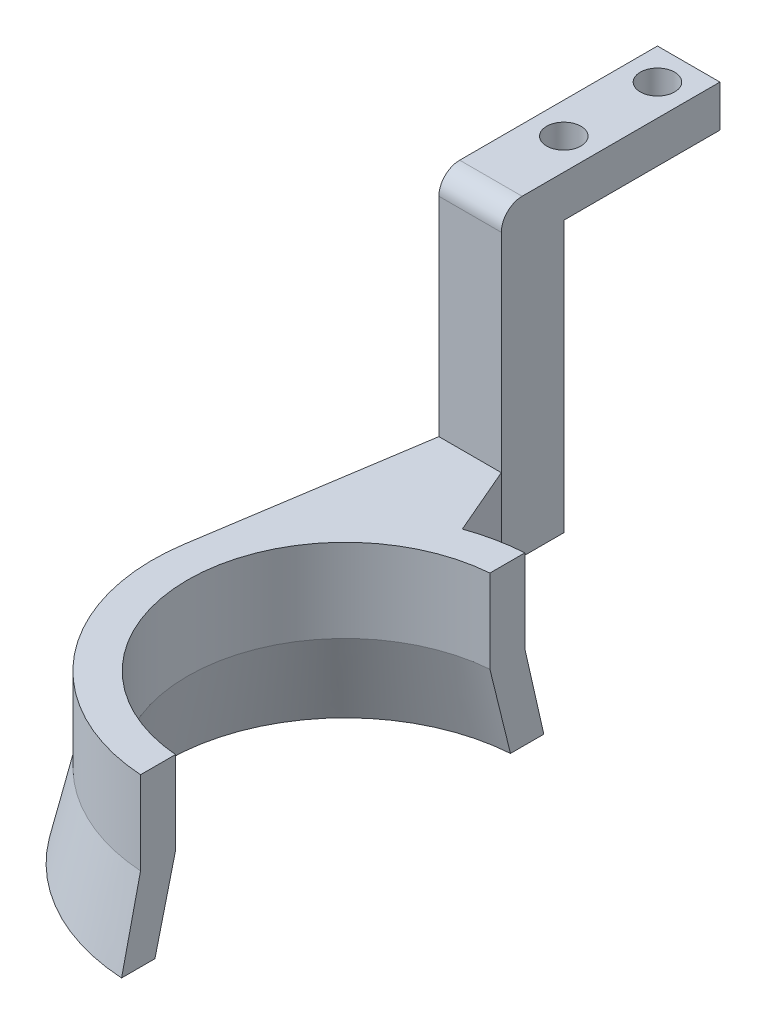
ISO-10303-21;
HEADER;
FILE_DESCRIPTION(('STEP AP214'),'2;1');
FILE_NAME('part.step','',(''),(''),'','','');
FILE_SCHEMA(('AUTOMOTIVE_DESIGN { 1 0 10303 214 1 1 1 1 }'));
ENDSEC;
DATA;
#1=APPLICATION_CONTEXT('core data for automotive mechanical design processes');
#2=APPLICATION_PROTOCOL_DEFINITION('international standard','automotive_design',2000,#1);
#3=PRODUCT_CONTEXT('',#1,'mechanical');
#4=PRODUCT('Part','Part','',(#3));
#5=PRODUCT_RELATED_PRODUCT_CATEGORY('part','',(#4));
#6=PRODUCT_DEFINITION_FORMATION('','',#4);
#7=PRODUCT_DEFINITION_CONTEXT('part definition',#1,'design');
#8=PRODUCT_DEFINITION('design','',#6,#7);
#9=PRODUCT_DEFINITION_SHAPE('','',#8);
#10=(LENGTH_UNIT() NAMED_UNIT(*) SI_UNIT(.MILLI.,.METRE.));
#11=(NAMED_UNIT(*) PLANE_ANGLE_UNIT() SI_UNIT($,.RADIAN.));
#12=(NAMED_UNIT(*) SI_UNIT($,.STERADIAN.) SOLID_ANGLE_UNIT());
#13=UNCERTAINTY_MEASURE_WITH_UNIT(LENGTH_MEASURE(1.E-05),#10,'distance_accuracy_value','');
#14=(GEOMETRIC_REPRESENTATION_CONTEXT(3) GLOBAL_UNCERTAINTY_ASSIGNED_CONTEXT((#13)) GLOBAL_UNIT_ASSIGNED_CONTEXT((#10,
#11,#12)) REPRESENTATION_CONTEXT('',''));
#15=CARTESIAN_POINT('',(0.,0.,0.));
#16=DIRECTION('',(0.,0.,1.));
#17=DIRECTION('',(1.,0.,0.));
#18=AXIS2_PLACEMENT_3D('',#15,#16,#17);
#19=CARTESIAN_POINT('',(0.,-20.,0.));
#20=DIRECTION('',(0.,1.,0.));
#21=DIRECTION('',(0.,0.,1.));
#22=AXIS2_PLACEMENT_3D('',#19,#20,#21);
#23=PLANE('',#22);
#24=DIRECTION('',(1.,0.,0.));
#25=VECTOR('',#24,1.);
#26=CARTESIAN_POINT('',(0.,-20.,21.));
#27=LINE('',#26,#25);
#28=CARTESIAN_POINT('',(0.,-20.,21.));
#29=VERTEX_POINT('',#28);
#30=CARTESIAN_POINT('',(6.,-20.,21.));
#31=VERTEX_POINT('',#30);
#32=EDGE_CURVE('E361',#29,#31,#27,.T.);
#33=ORIENTED_EDGE('',*,*,#32,.F.);
#34=DIRECTION('',(-0.153201646089768,0.,0.988194948193617));
#35=VECTOR('',#34,1.);
#36=CARTESIAN_POINT('',(0.,-20.,21.));
#37=LINE('',#36,#35);
#38=CARTESIAN_POINT('',(-3.26704893613209,-20.,42.0734110017026));
#39=VERTEX_POINT('',#38);
#40=EDGE_CURVE('E223',#29,#39,#37,.T.);
#41=ORIENTED_EDGE('',*,*,#40,.T.);
#42=CARTESIAN_POINT('',(-3.26704893613209,-20.,42.0734110017026));
#43=DIRECTION('',(-0.15320164608977,0.,0.988194948193617));
#44=VECTOR('',#43,1.);
#45=LINE('',#42,#44);
#46=CARTESIAN_POINT('',(-3.29569718353048,-20.,42.2582004871701));
#47=VERTEX_POINT('',#46);
#48=EDGE_CURVE('E61',#39,#47,#45,.T.);
#49=ORIENTED_EDGE('',*,*,#48,.T.);
#50=CARTESIAN_POINT('',(15.,-20.,45.));
#51=DIRECTION('',(0.,1.,0.));
#52=DIRECTION('',(0.,0.,1.));
#53=AXIS2_PLACEMENT_3D('',#50,#51,#52);
#54=CIRCLE('',#53,18.5);
#55=CARTESIAN_POINT('',(13.8,-20.0000000000001,63.4610400573749));
#56=VERTEX_POINT('',#55);
#57=EDGE_CURVE('E242',#47,#56,#54,.T.);
#58=ORIENTED_EDGE('',*,*,#57,.T.);
#59=DIRECTION('',(0.,0.,1.));
#60=VECTOR('',#59,1.);
#61=CARTESIAN_POINT('',(13.8,-20.,0.));
#62=LINE('',#61,#60);
#63=CARTESIAN_POINT('',(13.8,-20.0000000000001,60.1024004714482));
#64=VERTEX_POINT('',#63);
#65=EDGE_CURVE('E245',#64,#56,#62,.T.);
#66=ORIENTED_EDGE('',*,*,#65,.F.);
#67=CARTESIAN_POINT('',(15.,-20.,45.));
#68=DIRECTION('',(0.,1.,0.));
#69=DIRECTION('',(0.,0.,1.));
#70=AXIS2_PLACEMENT_3D('',#67,#68,#69);
#71=CIRCLE('',#70,15.15);
#72=CARTESIAN_POINT('',(13.8,-20.,29.8975995285518));
#73=VERTEX_POINT('',#72);
#74=EDGE_CURVE('E230',#73,#64,#71,.T.);
#75=ORIENTED_EDGE('',*,*,#74,.F.);
#76=CARTESIAN_POINT('',(13.8,-20.,26.5389599426251));
#77=VERTEX_POINT('',#76);
#78=EDGE_CURVE('E239',#77,#73,#62,.T.);
#79=ORIENTED_EDGE('',*,*,#78,.F.);
#80=CARTESIAN_POINT('',(8.81617345650081,-20.,27.5641091629961));
#81=VERTEX_POINT('',#80);
#82=EDGE_CURVE('E234',#77,#81,#54,.T.);
#83=ORIENTED_EDGE('',*,*,#82,.T.);
#84=DIRECTION('',(0.394272189935279,0.,0.918993710665987));
#85=VECTOR('',#84,1.);
#86=CARTESIAN_POINT('',(-2.54171027819971,-20.,1.09045977783739));
#87=LINE('',#86,#85);
#88=EDGE_CURVE('E238',#31,#81,#87,.T.);
#89=ORIENTED_EDGE('',*,*,#88,.F.);
#90=EDGE_LOOP('',(#33,#41,#49,#58,#66,#75,#79,#83,#89));
#91=FACE_BOUND('',#90,.T.);
#92=ADVANCED_FACE('F51',(#91),#23,.T.);
#93=CARTESIAN_POINT('',(0.,-28.,0.));
#94=DIRECTION('',(0.,1.,0.));
#95=DIRECTION('',(0.,0.,1.));
#96=AXIS2_PLACEMENT_3D('',#93,#94,#95);
#97=PLANE('',#96);
#98=DIRECTION('',(0.394272189935279,0.,0.918993710665987));
#99=VECTOR('',#98,1.);
#100=CARTESIAN_POINT('',(-2.54171027819971,-28.,1.09045977783738));
#101=LINE('',#100,#99);
#102=CARTESIAN_POINT('',(6.,-28.,21.));
#103=VERTEX_POINT('',#102);
#104=CARTESIAN_POINT('',(8.81614120127154,-28.,27.5640274167845));
#105=VERTEX_POINT('',#104);
#106=EDGE_CURVE('E257',#103,#105,#101,.T.);
#107=ORIENTED_EDGE('',*,*,#106,.T.);
#108=CARTESIAN_POINT('',(13.8,-28.0000000000001,63.4610400573749));
#109=CARTESIAN_POINT('',(-18.8133971291866,-28.0000000000001,61.3411120125089));
#110=CARTESIAN_POINT('',(-18.8133971291866,-28.,28.6588879874911));
#111=CARTESIAN_POINT('',(13.8,-28.,26.5389599426251));
#112=(BOUNDED_CURVE() B_SPLINE_CURVE(3,(#108,#109,#110,#111),.UNSPECIFIED.,.F.,
.F.) B_SPLINE_CURVE_WITH_KNOTS((4,4),(0.,1.),
.UNSPECIFIED.) CURVE() GEOMETRIC_REPRESENTATION_ITEM() RATIONAL_B_SPLINE_CURVE((1.,
0.376576576576576,0.376576576576576,1.)) REPRESENTATION_ITEM(''));
#113=CARTESIAN_POINT('',(-3.2670484929375,-28.,42.0734110604464));
#114=VERTEX_POINT('',#113);
#115=EDGE_CURVE('E12',#105,#114,#112,.F.);
#116=ORIENTED_EDGE('',*,*,#115,.T.);
#117=DIRECTION('',(-0.153201646089768,0.,0.988194948193617));
#118=VECTOR('',#117,1.);
#119=CARTESIAN_POINT('',(0.,-28.,21.));
#120=LINE('',#119,#118);
#121=CARTESIAN_POINT('',(0.,-28.,21.));
#122=VERTEX_POINT('',#121);
#123=EDGE_CURVE('E220',#122,#114,#120,.T.);
#124=ORIENTED_EDGE('',*,*,#123,.F.);
#125=DIRECTION('',(0.,0.,-1.));
#126=VECTOR('',#125,1.);
#127=CARTESIAN_POINT('',(0.,-28.,15.));
#128=LINE('',#127,#126);
#129=CARTESIAN_POINT('',(0.,-28.,15.));
#130=VERTEX_POINT('',#129);
#131=EDGE_CURVE('E336',#122,#130,#128,.T.);
#132=ORIENTED_EDGE('',*,*,#131,.T.);
#133=DIRECTION('',(1.,0.,0.));
#134=VECTOR('',#133,1.);
#135=CARTESIAN_POINT('',(0.,-28.,15.));
#136=LINE('',#135,#134);
#137=CARTESIAN_POINT('',(6.00000000000001,-28.,15.));
#138=VERTEX_POINT('',#137);
#139=EDGE_CURVE('E338',#130,#138,#136,.T.);
#140=ORIENTED_EDGE('',*,*,#139,.T.);
#141=DIRECTION('',(0.,0.,1.));
#142=VECTOR('',#141,1.);
#143=CARTESIAN_POINT('',(6.00000000000001,-28.,15.));
#144=LINE('',#143,#142);
#145=EDGE_CURVE('E341',#138,#103,#144,.T.);
#146=ORIENTED_EDGE('',*,*,#145,.T.);
#147=EDGE_LOOP('',(#107,#116,#124,#132,#140,#146));
#148=FACE_BOUND('',#147,.T.);
#149=ADVANCED_FACE('F386',(#148),#97,.F.);
#150=CARTESIAN_POINT('',(13.8,-28.,0.));
#151=DIRECTION('',(-1.,0.,0.));
#152=DIRECTION('',(0.,0.,1.));
#153=AXIS2_PLACEMENT_3D('',#150,#151,#152);
#154=PLANE('',#153);
#155=DIRECTION('',(0.,1.,0.));
#156=VECTOR('',#155,1.);
#157=CARTESIAN_POINT('',(13.8,-28.0000000000001,63.4610400573749));
#158=LINE('',#157,#156);
#159=CARTESIAN_POINT('',(13.8,-28.0000000000001,63.4610400573749));
#160=VERTEX_POINT('',#159);
#161=EDGE_CURVE('E295',#160,#56,#158,.T.);
#162=ORIENTED_EDGE('',*,*,#161,.F.);
#163=DIRECTION('',(0.,-0.97499269726956,0.222236901236109));
#164=VECTOR('',#163,1.);
#165=CARTESIAN_POINT('',(13.8,-28.0000000000001,63.4610400573749));
#166=LINE('',#165,#164);
#167=CARTESIAN_POINT('',(13.8,-36.0000000000001,65.2845359818754));
#168=VERTEX_POINT('',#167);
#169=EDGE_CURVE('E432',#160,#168,#166,.T.);
#170=ORIENTED_EDGE('',*,*,#169,.T.);
#171=DIRECTION('',(0.,0.,1.));
#172=VECTOR('',#171,1.);
#173=CARTESIAN_POINT('',(13.8,-36.0000000000001,62.0778921415964));
#174=LINE('',#173,#172);
#175=CARTESIAN_POINT('',(13.8,-36.0000000000001,62.0778921415964));
#176=VERTEX_POINT('',#175);
#177=EDGE_CURVE('E303',#176,#168,#174,.T.);
#178=ORIENTED_EDGE('',*,*,#177,.F.);
#179=DIRECTION('',(0.,-0.970838274147742,0.239735365454984));
#180=VECTOR('',#179,1.);
#181=CARTESIAN_POINT('',(13.8,-28.0000000000001,60.1024004714482));
#182=LINE('',#181,#180);
#183=CARTESIAN_POINT('',(13.8,-28.,60.1024004714482));
#184=VERTEX_POINT('',#183);
#185=EDGE_CURVE('E433',#184,#176,#182,.T.);
#186=ORIENTED_EDGE('',*,*,#185,.F.);
#187=DIRECTION('',(0.,1.,0.));
#188=VECTOR('',#187,1.);
#189=CARTESIAN_POINT('',(13.8,-28.0010000000001,60.1024004714482));
#190=LINE('',#189,#188);
#191=EDGE_CURVE('E232',#184,#64,#190,.T.);
#192=ORIENTED_EDGE('',*,*,#191,.T.);
#193=ORIENTED_EDGE('',*,*,#65,.T.);
#194=EDGE_LOOP('',(#162,#170,#178,#186,#192,#193));
#195=FACE_BOUND('',#194,.T.);
#196=ADVANCED_FACE('F380',(#195),#154,.F.);
#197=CARTESIAN_POINT('',(6.,2.,0.));
#198=DIRECTION('',(-1.,0.,0.));
#199=DIRECTION('',(0.,0.,1.));
#200=AXIS2_PLACEMENT_3D('',#197,#198,#199);
#201=PLANE('',#200);
#202=DIRECTION('',(0.,0.,1.));
#203=VECTOR('',#202,1.);
#204=CARTESIAN_POINT('',(6.,-2.,15.));
#205=LINE('',#204,#203);
#206=CARTESIAN_POINT('',(6.,-2.,0.));
#207=VERTEX_POINT('',#206);
#208=CARTESIAN_POINT('',(6.,-2.,15.));
#209=VERTEX_POINT('',#208);
#210=EDGE_CURVE('E426',#207,#209,#205,.T.);
#211=ORIENTED_EDGE('',*,*,#210,.F.);
#212=DIRECTION('',(0.,-1.,0.));
#213=VECTOR('',#212,1.);
#214=CARTESIAN_POINT('',(6.,2.,0.));
#215=LINE('',#214,#213);
#216=CARTESIAN_POINT('',(6.,2.,0.));
#217=VERTEX_POINT('',#216);
#218=EDGE_CURVE('E192',#217,#207,#215,.T.);
#219=ORIENTED_EDGE('',*,*,#218,.F.);
#220=DIRECTION('',(0.,0.,-1.));
#221=VECTOR('',#220,1.);
#222=CARTESIAN_POINT('',(6.,2.,0.));
#223=LINE('',#222,#221);
#224=CARTESIAN_POINT('',(6.00000000000001,2.,19.));
#225=VERTEX_POINT('',#224);
#226=EDGE_CURVE('E177',#225,#217,#223,.T.);
#227=ORIENTED_EDGE('',*,*,#226,.F.);
#228=CARTESIAN_POINT('',(6.00000000000001,0.,19.));
#229=DIRECTION('',(1.,0.,0.));
#230=DIRECTION('',(0.,0.,-1.));
#231=AXIS2_PLACEMENT_3D('',#228,#229,#230);
#232=CIRCLE('',#231,2.);
#233=CARTESIAN_POINT('',(6.00000000000001,0.,21.));
#234=VERTEX_POINT('',#233);
#235=EDGE_CURVE('E356',#225,#234,#232,.T.);
#236=ORIENTED_EDGE('',*,*,#235,.T.);
#237=DIRECTION('',(0.,-1.,0.));
#238=VECTOR('',#237,1.);
#239=CARTESIAN_POINT('',(6.00000000000001,0.,21.));
#240=LINE('',#239,#238);
#241=EDGE_CURVE('E348',#234,#31,#240,.T.);
#242=ORIENTED_EDGE('',*,*,#241,.T.);
#243=DIRECTION('',(0.,1.,0.));
#244=VECTOR('',#243,1.);
#245=CARTESIAN_POINT('',(6.,-28.,21.));
#246=LINE('',#245,#244);
#247=EDGE_CURVE('E334',#103,#31,#246,.T.);
#248=ORIENTED_EDGE('',*,*,#247,.F.);
#249=ORIENTED_EDGE('',*,*,#145,.F.);
#250=DIRECTION('',(0.,1.,0.));
#251=VECTOR('',#250,1.);
#252=CARTESIAN_POINT('',(6.,2.,15.));
#253=LINE('',#252,#251);
#254=EDGE_CURVE('E344',#138,#209,#253,.T.);
#255=ORIENTED_EDGE('',*,*,#254,.T.);
#256=EDGE_LOOP('',(#211,#219,#227,#236,#242,#248,#249,#255));
#257=FACE_BOUND('',#256,.T.);
#258=ADVANCED_FACE('F372',(#257),#201,.F.);
#259=CARTESIAN_POINT('',(0.,2.,0.));
#260=DIRECTION('',(0.,1.,0.));
#261=DIRECTION('',(0.,0.,1.));
#262=AXIS2_PLACEMENT_3D('',#259,#260,#261);
#263=PLANE('',#262);
#264=CARTESIAN_POINT('',(3.,2.,3.));
#265=DIRECTION('',(0.,1.,0.));
#266=DIRECTION('',(0.,0.,1.));
#267=AXIS2_PLACEMENT_3D('',#264,#265,#266);
#268=CIRCLE('',#267,1.65);
#269=CARTESIAN_POINT('',(3.,2.,4.65));
#270=VERTEX_POINT('',#269);
#271=EDGE_CURVE('E199',#270,#270,#268,.T.);
#272=ORIENTED_EDGE('',*,*,#271,.F.);
#273=EDGE_LOOP('',(#272));
#274=FACE_BOUND('',#273,.T.);
#275=DIRECTION('',(0.,0.,1.));
#276=VECTOR('',#275,1.);
#277=CARTESIAN_POINT('',(0.,2.,0.));
#278=LINE('',#277,#276);
#279=CARTESIAN_POINT('',(0.,2.,0.));
#280=VERTEX_POINT('',#279);
#281=CARTESIAN_POINT('',(0.,2.,19.));
#282=VERTEX_POINT('',#281);
#283=EDGE_CURVE('E175',#280,#282,#278,.T.);
#284=ORIENTED_EDGE('',*,*,#283,.T.);
#285=DIRECTION('',(1.,0.,0.));
#286=VECTOR('',#285,1.);
#287=CARTESIAN_POINT('',(0.,2.,19.));
#288=LINE('',#287,#286);
#289=EDGE_CURVE('E353',#282,#225,#288,.T.);
#290=ORIENTED_EDGE('',*,*,#289,.T.);
#291=ORIENTED_EDGE('',*,*,#226,.T.);
#292=DIRECTION('',(-1.,0.,0.));
#293=VECTOR('',#292,1.);
#294=CARTESIAN_POINT('',(0.,2.,0.));
#295=LINE('',#294,#293);
#296=EDGE_CURVE('E169',#217,#280,#295,.T.);
#297=ORIENTED_EDGE('',*,*,#296,.T.);
#298=EDGE_LOOP('',(#284,#290,#291,#297));
#299=FACE_BOUND('',#298,.T.);
#300=CARTESIAN_POINT('',(3.,2.,12.));
#301=DIRECTION('',(0.,1.,0.));
#302=DIRECTION('',(0.,0.,1.));
#303=AXIS2_PLACEMENT_3D('',#300,#301,#302);
#304=CIRCLE('',#303,1.65);
#305=CARTESIAN_POINT('',(3.,2.,13.65));
#306=VERTEX_POINT('',#305);
#307=EDGE_CURVE('E203',#306,#306,#304,.T.);
#308=ORIENTED_EDGE('',*,*,#307,.F.);
#309=EDGE_LOOP('',(#308));
#310=FACE_BOUND('',#309,.T.);
#311=ADVANCED_FACE('F171',(#274,#299,#310),#263,.T.);
#312=CARTESIAN_POINT('',(0.,2.,0.));
#313=DIRECTION('',(1.,0.,0.));
#314=DIRECTION('',(0.,0.,-1.));
#315=AXIS2_PLACEMENT_3D('',#312,#313,#314);
#316=PLANE('',#315);
#317=ORIENTED_EDGE('',*,*,#131,.F.);
#318=DIRECTION('',(0.,1.,0.));
#319=VECTOR('',#318,1.);
#320=CARTESIAN_POINT('',(0.,-28.,21.));
#321=LINE('',#320,#319);
#322=EDGE_CURVE('E218',#122,#29,#321,.T.);
#323=ORIENTED_EDGE('',*,*,#322,.T.);
#324=DIRECTION('',(0.,-1.,0.));
#325=VECTOR('',#324,1.);
#326=CARTESIAN_POINT('',(0.,0.,21.));
#327=LINE('',#326,#325);
#328=CARTESIAN_POINT('',(0.,0.,21.));
#329=VERTEX_POINT('',#328);
#330=EDGE_CURVE('E350',#329,#29,#327,.T.);
#331=ORIENTED_EDGE('',*,*,#330,.F.);
#332=CARTESIAN_POINT('',(0.,0.,19.));
#333=DIRECTION('',(1.,0.,0.));
#334=DIRECTION('',(0.,0.,-1.));
#335=AXIS2_PLACEMENT_3D('',#332,#333,#334);
#336=CIRCLE('',#335,2.);
#337=EDGE_CURVE('E198',#282,#329,#336,.T.);
#338=ORIENTED_EDGE('',*,*,#337,.F.);
#339=ORIENTED_EDGE('',*,*,#283,.F.);
#340=DIRECTION('',(0.,-1.,0.));
#341=VECTOR('',#340,1.);
#342=CARTESIAN_POINT('',(0.,2.,0.));
#343=LINE('',#342,#341);
#344=CARTESIAN_POINT('',(0.,-2.,0.));
#345=VERTEX_POINT('',#344);
#346=EDGE_CURVE('E181',#280,#345,#343,.T.);
#347=ORIENTED_EDGE('',*,*,#346,.T.);
#348=DIRECTION('',(0.,0.,-1.));
#349=VECTOR('',#348,1.);
#350=CARTESIAN_POINT('',(0.,-2.,15.));
#351=LINE('',#350,#349);
#352=CARTESIAN_POINT('',(0.,-2.,15.));
#353=VERTEX_POINT('',#352);
#354=EDGE_CURVE('E421',#353,#345,#351,.T.);
#355=ORIENTED_EDGE('',*,*,#354,.F.);
#356=DIRECTION('',(0.,1.,0.));
#357=VECTOR('',#356,1.);
#358=CARTESIAN_POINT('',(0.,2.,15.));
#359=LINE('',#358,#357);
#360=EDGE_CURVE('E345',#130,#353,#359,.T.);
#361=ORIENTED_EDGE('',*,*,#360,.F.);
#362=EDGE_LOOP('',(#317,#323,#331,#338,#339,#347,#355,#361));
#363=FACE_BOUND('',#362,.T.);
#364=ADVANCED_FACE('F53',(#363),#316,.F.);
#365=CARTESIAN_POINT('',(0.,2.,0.));
#366=DIRECTION('',(0.,0.,1.));
#367=DIRECTION('',(1.,0.,0.));
#368=AXIS2_PLACEMENT_3D('',#365,#366,#367);
#369=PLANE('',#368);
#370=ORIENTED_EDGE('',*,*,#218,.T.);
#371=DIRECTION('',(1.,0.,0.));
#372=VECTOR('',#371,1.);
#373=CARTESIAN_POINT('',(0.,-2.,0.));
#374=LINE('',#373,#372);
#375=EDGE_CURVE('E188',#345,#207,#374,.T.);
#376=ORIENTED_EDGE('',*,*,#375,.F.);
#377=ORIENTED_EDGE('',*,*,#346,.F.);
#378=ORIENTED_EDGE('',*,*,#296,.F.);
#379=EDGE_LOOP('',(#370,#376,#377,#378));
#380=FACE_BOUND('',#379,.T.);
#381=ADVANCED_FACE('F185',(#380),#369,.F.);
#382=CARTESIAN_POINT('',(3.,2.,3.));
#383=DIRECTION('',(0.,-1.,0.));
#384=DIRECTION('',(0.,0.,-1.));
#385=AXIS2_PLACEMENT_3D('',#382,#383,#384);
#386=CYLINDRICAL_SURFACE('',#385,1.65);
#387=ORIENTED_EDGE('',*,*,#271,.T.);
#388=EDGE_LOOP('',(#387));
#389=FACE_BOUND('',#388,.T.);
#390=CARTESIAN_POINT('',(3.,-2.,3.));
#391=DIRECTION('',(0.,-1.,0.));
#392=DIRECTION('',(0.,0.,-1.));
#393=AXIS2_PLACEMENT_3D('',#390,#391,#392);
#394=CIRCLE('',#393,1.65);
#395=CARTESIAN_POINT('',(3.,-2.,1.35));
#396=VERTEX_POINT('',#395);
#397=EDGE_CURVE('E416',#396,#396,#394,.T.);
#398=ORIENTED_EDGE('',*,*,#397,.T.);
#399=EDGE_LOOP('',(#398));
#400=FACE_BOUND('',#399,.T.);
#401=ADVANCED_FACE('F407',(#389,#400),#386,.F.);
#402=CARTESIAN_POINT('',(3.,2.,12.));
#403=DIRECTION('',(0.,-1.,0.));
#404=DIRECTION('',(0.,0.,-1.));
#405=AXIS2_PLACEMENT_3D('',#402,#403,#404);
#406=CYLINDRICAL_SURFACE('',#405,1.65);
#407=ORIENTED_EDGE('',*,*,#307,.T.);
#408=EDGE_LOOP('',(#407));
#409=FACE_BOUND('',#408,.T.);
#410=CARTESIAN_POINT('',(3.,-2.,12.));
#411=DIRECTION('',(0.,-1.,0.));
#412=DIRECTION('',(0.,0.,-1.));
#413=AXIS2_PLACEMENT_3D('',#410,#411,#412);
#414=CIRCLE('',#413,1.65);
#415=CARTESIAN_POINT('',(3.,-2.,10.35));
#416=VERTEX_POINT('',#415);
#417=EDGE_CURVE('E418',#416,#416,#414,.T.);
#418=ORIENTED_EDGE('',*,*,#417,.T.);
#419=EDGE_LOOP('',(#418));
#420=FACE_BOUND('',#419,.T.);
#421=ADVANCED_FACE('F369',(#409,#420),#406,.F.);
#422=CARTESIAN_POINT('',(0.,2.,15.));
#423=DIRECTION('',(0.,0.,-1.));
#424=DIRECTION('',(-1.,0.,0.));
#425=AXIS2_PLACEMENT_3D('',#422,#423,#424);
#426=PLANE('',#425);
#427=DIRECTION('',(-1.,0.,0.));
#428=VECTOR('',#427,1.);
#429=CARTESIAN_POINT('',(0.,-2.,15.));
#430=LINE('',#429,#428);
#431=EDGE_CURVE('E429',#209,#353,#430,.T.);
#432=ORIENTED_EDGE('',*,*,#431,.F.);
#433=ORIENTED_EDGE('',*,*,#254,.F.);
#434=ORIENTED_EDGE('',*,*,#139,.F.);
#435=ORIENTED_EDGE('',*,*,#360,.T.);
#436=EDGE_LOOP('',(#432,#433,#434,#435));
#437=FACE_BOUND('',#436,.T.);
#438=ADVANCED_FACE('F399',(#437),#426,.T.);
#439=CARTESIAN_POINT('',(0.,0.,21.));
#440=DIRECTION('',(0.,0.,1.));
#441=DIRECTION('',(1.,0.,0.));
#442=AXIS2_PLACEMENT_3D('',#439,#440,#441);
#443=PLANE('',#442);
#444=ORIENTED_EDGE('',*,*,#241,.F.);
#445=DIRECTION('',(1.,0.,0.));
#446=VECTOR('',#445,1.);
#447=CARTESIAN_POINT('',(0.,0.,21.));
#448=LINE('',#447,#446);
#449=EDGE_CURVE('E364',#329,#234,#448,.T.);
#450=ORIENTED_EDGE('',*,*,#449,.F.);
#451=ORIENTED_EDGE('',*,*,#330,.T.);
#452=ORIENTED_EDGE('',*,*,#32,.T.);
#453=EDGE_LOOP('',(#444,#450,#451,#452));
#454=FACE_BOUND('',#453,.T.);
#455=ADVANCED_FACE('F396',(#454),#443,.T.);
#456=CARTESIAN_POINT('',(0.,0.,19.));
#457=DIRECTION('',(1.,0.,0.));
#458=DIRECTION('',(0.,0.,-1.));
#459=AXIS2_PLACEMENT_3D('',#456,#457,#458);
#460=CYLINDRICAL_SURFACE('',#459,2.);
#461=ORIENTED_EDGE('',*,*,#235,.F.);
#462=ORIENTED_EDGE('',*,*,#289,.F.);
#463=ORIENTED_EDGE('',*,*,#337,.T.);
#464=ORIENTED_EDGE('',*,*,#449,.T.);
#465=EDGE_LOOP('',(#461,#462,#463,#464));
#466=FACE_BOUND('',#465,.T.);
#467=ADVANCED_FACE('F398',(#466),#460,.T.);
#468=CARTESIAN_POINT('',(-2.54171027819971,-28.,1.09045977783738));
#469=DIRECTION('',(-0.918993710665987,0.,0.394272189935279));
#470=DIRECTION('',(0.394272189935279,0.,0.918993710665987));
#471=AXIS2_PLACEMENT_3D('',#468,#469,#470);
#472=PLANE('',#471);
#473=ORIENTED_EDGE('',*,*,#88,.T.);
#474=DIRECTION('',(0.,1.,0.));
#475=VECTOR('',#474,1.);
#476=CARTESIAN_POINT('',(8.81617345650081,-28.,27.5641091629961));
#477=LINE('',#476,#475);
#478=EDGE_CURVE('E294',#105,#81,#477,.T.);
#479=ORIENTED_EDGE('',*,*,#478,.F.);
#480=ORIENTED_EDGE('',*,*,#106,.F.);
#481=ORIENTED_EDGE('',*,*,#247,.T.);
#482=EDGE_LOOP('',(#473,#479,#480,#481));
#483=FACE_BOUND('',#482,.T.);
#484=ADVANCED_FACE('F270',(#483),#472,.F.);
#485=CARTESIAN_POINT('',(15.,-28.,45.));
#486=DIRECTION('',(0.,1.,0.));
#487=DIRECTION('',(0.,0.,1.));
#488=AXIS2_PLACEMENT_3D('',#485,#486,#487);
#489=CYLINDRICAL_SURFACE('',#488,18.5);
#490=ORIENTED_EDGE('',*,*,#82,.F.);
#491=DIRECTION('',(0.,1.,0.));
#492=VECTOR('',#491,1.);
#493=CARTESIAN_POINT('',(13.8,-28.,26.5389599426251));
#494=LINE('',#493,#492);
#495=CARTESIAN_POINT('',(13.8,-28.0000000000001,26.5389599426251));
#496=VERTEX_POINT('',#495);
#497=EDGE_CURVE('E287',#496,#77,#494,.T.);
#498=ORIENTED_EDGE('',*,*,#497,.F.);
#499=CARTESIAN_POINT('',(15.,-28.,45.));
#500=DIRECTION('',(0.,1.,0.));
#501=DIRECTION('',(0.,0.,1.));
#502=AXIS2_PLACEMENT_3D('',#499,#500,#501);
#503=CIRCLE('',#502,18.5);
#504=EDGE_CURVE('E95',#496,#105,#503,.T.);
#505=ORIENTED_EDGE('',*,*,#504,.T.);
#506=ORIENTED_EDGE('',*,*,#478,.T.);
#507=EDGE_LOOP('',(#490,#498,#505,#506));
#508=FACE_BOUND('',#507,.T.);
#509=ADVANCED_FACE('F259',(#508),#489,.T.);
#510=ORIENTED_EDGE('',*,*,#78,.T.);
#511=DIRECTION('',(0.,1.,0.));
#512=VECTOR('',#511,1.);
#513=CARTESIAN_POINT('',(13.8,-28.0010000000001,29.8975995285517));
#514=LINE('',#513,#512);
#515=CARTESIAN_POINT('',(13.8,-28.,29.8975995285517));
#516=VERTEX_POINT('',#515);
#517=EDGE_CURVE('E246',#516,#73,#514,.T.);
#518=ORIENTED_EDGE('',*,*,#517,.F.);
#519=DIRECTION('',(0.,-0.970838274147741,-0.239735365454985));
#520=VECTOR('',#519,1.);
#521=CARTESIAN_POINT('',(13.8,-28.,29.8975995285517));
#522=LINE('',#521,#520);
#523=CARTESIAN_POINT('',(13.8,-36.,27.9221078584036));
#524=VERTEX_POINT('',#523);
#525=EDGE_CURVE('E85',#516,#524,#522,.T.);
#526=ORIENTED_EDGE('',*,*,#525,.T.);
#527=DIRECTION('',(0.,0.,1.));
#528=VECTOR('',#527,1.);
#529=CARTESIAN_POINT('',(13.8,-36.,24.7154640181245));
#530=LINE('',#529,#528);
#531=CARTESIAN_POINT('',(13.8,-36.,24.7154640181245));
#532=VERTEX_POINT('',#531);
#533=EDGE_CURVE('E227',#532,#524,#530,.T.);
#534=ORIENTED_EDGE('',*,*,#533,.F.);
#535=DIRECTION('',(0.,-0.974992697269559,-0.222236901236111));
#536=VECTOR('',#535,1.);
#537=CARTESIAN_POINT('',(13.8,-32.,25.6272119803748));
#538=LINE('',#537,#536);
#539=EDGE_CURVE('E435',#496,#532,#538,.T.);
#540=ORIENTED_EDGE('',*,*,#539,.F.);
#541=ORIENTED_EDGE('',*,*,#497,.T.);
#542=EDGE_LOOP('',(#510,#518,#526,#534,#540,#541));
#543=FACE_BOUND('',#542,.T.);
#544=ADVANCED_FACE('F269',(#543),#154,.F.);
#545=CARTESIAN_POINT('',(13.8,-28.0000000000001,63.4610400573749));
#546=CARTESIAN_POINT('',(-18.8133971291866,-28.0000000000001,61.3411120125089));
#547=CARTESIAN_POINT('',(-18.8133971291866,-28.,28.6588879874911));
#548=CARTESIAN_POINT('',(13.8,-28.,26.5389599426251));
#549=(BOUNDED_CURVE() B_SPLINE_CURVE(3,(#545,#546,#547,#548),.UNSPECIFIED.,.F.,
.F.) B_SPLINE_CURVE_WITH_KNOTS((4,4),(0.,1.),
.UNSPECIFIED.) CURVE() GEOMETRIC_REPRESENTATION_ITEM() RATIONAL_B_SPLINE_CURVE((1.,
0.376576576576576,0.376576576576576,1.)) REPRESENTATION_ITEM(''));
#550=CARTESIAN_POINT('',(-3.29569610960051,-28.,42.2582006323139));
#551=VERTEX_POINT('',#550);
#552=EDGE_CURVE('E212',#114,#551,#549,.F.);
#553=ORIENTED_EDGE('',*,*,#552,.T.);
#554=CARTESIAN_POINT('',(13.8,-28.0000000000001,63.4610400573749));
#555=CARTESIAN_POINT('',(-18.8133971291866,-28.0000000000001,61.3411120125089));
#556=CARTESIAN_POINT('',(-18.8133971291866,-28.,28.6588879874911));
#557=CARTESIAN_POINT('',(13.8,-28.,26.5389599426251));
#558=(BOUNDED_CURVE() B_SPLINE_CURVE(3,(#554,#555,#556,#557),.UNSPECIFIED.,.F.,
.F.) B_SPLINE_CURVE_WITH_KNOTS((4,4),(0.,1.),
.UNSPECIFIED.) CURVE() GEOMETRIC_REPRESENTATION_ITEM() RATIONAL_B_SPLINE_CURVE((1.,
0.376576576576576,0.376576576576576,1.)) REPRESENTATION_ITEM(''));
#559=EDGE_CURVE('E324',#551,#160,#558,.F.);
#560=ORIENTED_EDGE('',*,*,#559,.T.);
#561=ORIENTED_EDGE('',*,*,#161,.T.);
#562=ORIENTED_EDGE('',*,*,#57,.F.);
#563=ORIENTED_EDGE('',*,*,#48,.F.);
#564=DIRECTION('',(0.,1.,0.));
#565=VECTOR('',#564,1.);
#566=CARTESIAN_POINT('',(-3.26704893613223,-28.,42.0734110017035));
#567=LINE('',#566,#565);
#568=EDGE_CURVE('E208',#114,#39,#567,.T.);
#569=ORIENTED_EDGE('',*,*,#568,.F.);
#570=EDGE_LOOP('',(#553,#560,#561,#562,#563,#569));
#571=FACE_BOUND('',#570,.T.);
#572=ADVANCED_FACE('F272',(#571),#489,.T.);
#573=CARTESIAN_POINT('',(15.,-28.0010000000001,45.));
#574=DIRECTION('',(0.,1.,0.));
#575=DIRECTION('',(0.,0.,1.));
#576=AXIS2_PLACEMENT_3D('',#573,#574,#575);
#577=CYLINDRICAL_SURFACE('',#576,15.15);
#578=CARTESIAN_POINT('',(15.,-28.,45.));
#579=DIRECTION('',(0.,1.,0.));
#580=DIRECTION('',(0.,0.,1.));
#581=AXIS2_PLACEMENT_3D('',#578,#579,#580);
#582=CIRCLE('',#581,15.15);
#583=EDGE_CURVE('E233',#184,#516,#582,.F.);
#584=ORIENTED_EDGE('',*,*,#583,.T.);
#585=ORIENTED_EDGE('',*,*,#517,.T.);
#586=ORIENTED_EDGE('',*,*,#74,.T.);
#587=ORIENTED_EDGE('',*,*,#191,.F.);
#588=EDGE_LOOP('',(#584,#585,#586,#587));
#589=FACE_BOUND('',#588,.T.);
#590=ADVANCED_FACE('F542',(#589),#577,.F.);
#591=CARTESIAN_POINT('',(0.,-28.,21.));
#592=DIRECTION('',(-0.988194948193617,0.,-0.153201646089768));
#593=DIRECTION('',(-0.153201646089768,0.,0.988194948193617));
#594=AXIS2_PLACEMENT_3D('',#591,#592,#593);
#595=PLANE('',#594);
#596=ORIENTED_EDGE('',*,*,#123,.T.);
#597=ORIENTED_EDGE('',*,*,#568,.T.);
#598=ORIENTED_EDGE('',*,*,#40,.F.);
#599=ORIENTED_EDGE('',*,*,#322,.F.);
#600=EDGE_LOOP('',(#596,#597,#598,#599));
#601=FACE_BOUND('',#600,.T.);
#602=ADVANCED_FACE('F563',(#601),#595,.T.);
#603=CARTESIAN_POINT('',(15.,-36.,45.));
#604=DIRECTION('',(0.,1.,0.));
#605=DIRECTION('',(0.,0.,1.));
#606=AXIS2_PLACEMENT_3D('',#603,#604,#605);
#607=PLANE('',#606);
#608=CARTESIAN_POINT('',(15.,-36.,45.));
#609=DIRECTION('',(0.,1.,0.));
#610=DIRECTION('',(0.,0.,1.));
#611=AXIS2_PLACEMENT_3D('',#608,#609,#610);
#612=CIRCLE('',#611,17.12);
#613=EDGE_CURVE('E501',#524,#176,#612,.T.);
#614=ORIENTED_EDGE('',*,*,#613,.T.);
#615=ORIENTED_EDGE('',*,*,#177,.T.);
#616=CARTESIAN_POINT('',(15.,-36.,45.));
#617=DIRECTION('',(0.,-1.,0.));
#618=DIRECTION('',(0.,0.,1.));
#619=AXIS2_PLACEMENT_3D('',#616,#617,#618);
#620=CIRCLE('',#619,20.32);
#621=EDGE_CURVE('E101',#168,#532,#620,.T.);
#622=ORIENTED_EDGE('',*,*,#621,.T.);
#623=ORIENTED_EDGE('',*,*,#533,.T.);
#624=EDGE_LOOP('',(#614,#615,#622,#623));
#625=FACE_BOUND('',#624,.T.);
#626=ADVANCED_FACE('F467',(#625),#607,.F.);
#627=CARTESIAN_POINT('',(13.8,-28.,29.8975995285517));
#628=CARTESIAN_POINT('',(13.8,-36.,27.9221078584036));
#629=CARTESIAN_POINT('',(-12.1923076923077,-28.,31.9628850631088));
#630=CARTESIAN_POINT('',(-16.0826229508197,-36.,30.0218486954851));
#631=CARTESIAN_POINT('',(-12.1923076923077,-28.0000000000001,58.0371149368912));
#632=CARTESIAN_POINT('',(-16.0826229508197,-36.0000000000001,59.9781513045149));
#633=CARTESIAN_POINT('',(13.8,-28.0000000000001,60.1024004714482));
#634=CARTESIAN_POINT('',(13.8,-36.0000000000001,62.0778921415964));
#635=(BOUNDED_SURFACE() B_SPLINE_SURFACE(3,1,((#627,#628),(#629,#630),(#631,#632),(#633,#634)),
.UNSPECIFIED.,.F.,.F.,.F.) B_SPLINE_SURFACE_WITH_KNOTS((4,4),(2,2),(0.,1.),(0.,1.),
.UNSPECIFIED.) GEOMETRIC_REPRESENTATION_ITEM() RATIONAL_B_SPLINE_SURFACE(((1.,1.),
(0.386138613861386,0.38006230529595),(0.386138613861386,0.38006230529595),(1.,1.))) REPRESENTATION_ITEM('') SURFACE());
#636=ORIENTED_EDGE('',*,*,#583,.F.);
#637=ORIENTED_EDGE('',*,*,#185,.T.);
#638=ORIENTED_EDGE('',*,*,#613,.F.);
#639=ORIENTED_EDGE('',*,*,#525,.F.);
#640=EDGE_LOOP('',(#636,#637,#638,#639));
#641=FACE_BOUND('',#640,.T.);
#642=ADVANCED_FACE('F462',(#641),#635,.T.);
#643=CARTESIAN_POINT('',(13.8,-28.0000000000001,63.4610400573749));
#644=CARTESIAN_POINT('',(13.8,-36.0000000000001,65.2845359818754));
#645=CARTESIAN_POINT('',(-18.8133971291866,-28.0000000000001,61.3411120125089));
#646=CARTESIAN_POINT('',(-22.4202816901408,-36.0000000000001,63.1418033077337));
#647=CARTESIAN_POINT('',(-18.8133971291866,-28.,28.6588879874911));
#648=CARTESIAN_POINT('',(-22.4202816901408,-36.,26.8581966922663));
#649=CARTESIAN_POINT('',(13.8,-28.,26.5389599426251));
#650=CARTESIAN_POINT('',(13.8,-36.,24.7154640181245));
#651=(BOUNDED_SURFACE() B_SPLINE_SURFACE(3,1,((#643,#644),(#645,#646),(#647,#648),(#649,#650)),
.UNSPECIFIED.,.F.,.F.,.F.) B_SPLINE_SURFACE_WITH_KNOTS((4,4),(2,2),(0.,1.),(0.,1.),
.UNSPECIFIED.) GEOMETRIC_REPRESENTATION_ITEM() RATIONAL_B_SPLINE_SURFACE(((1.,1.),
(0.376576576576576,0.372703412073491),(0.376576576576576,0.372703412073491),(1.,1.))) REPRESENTATION_ITEM('') SURFACE());
#652=ORIENTED_EDGE('',*,*,#559,.F.);
#653=ORIENTED_EDGE('',*,*,#552,.F.);
#654=ORIENTED_EDGE('',*,*,#115,.F.);
#655=ORIENTED_EDGE('',*,*,#504,.F.);
#656=ORIENTED_EDGE('',*,*,#539,.T.);
#657=ORIENTED_EDGE('',*,*,#621,.F.);
#658=ORIENTED_EDGE('',*,*,#169,.F.);
#659=EDGE_LOOP('',(#652,#653,#654,#655,#656,#657,#658));
#660=FACE_BOUND('',#659,.T.);
#661=ADVANCED_FACE('F449',(#660),#651,.T.);
#662=CARTESIAN_POINT('',(0.,-2.,0.));
#663=DIRECTION('',(0.,-1.,0.));
#664=DIRECTION('',(0.,0.,-1.));
#665=AXIS2_PLACEMENT_3D('',#662,#663,#664);
#666=PLANE('',#665);
#667=ORIENTED_EDGE('',*,*,#417,.F.);
#668=EDGE_LOOP('',(#667));
#669=FACE_BOUND('',#668,.T.);
#670=ORIENTED_EDGE('',*,*,#354,.T.);
#671=ORIENTED_EDGE('',*,*,#375,.T.);
#672=ORIENTED_EDGE('',*,*,#210,.T.);
#673=ORIENTED_EDGE('',*,*,#431,.T.);
#674=EDGE_LOOP('',(#670,#671,#672,#673));
#675=FACE_BOUND('',#674,.T.);
#676=ORIENTED_EDGE('',*,*,#397,.F.);
#677=EDGE_LOOP('',(#676));
#678=FACE_BOUND('',#677,.T.);
#679=ADVANCED_FACE('F461',(#669,#675,#678),#666,.T.);
#680=CLOSED_SHELL('',(#92,#149,#196,#258,#311,#364,#381,#401,#421,#438,#455,#467,#484,#509,#544,
#572,#590,#602,#626,#642,#661,#679));
#681=MANIFOLD_SOLID_BREP('B2',#680);
#682=ADVANCED_BREP_SHAPE_REPRESENTATION('',(#18,#681),#14);
#683=SHAPE_DEFINITION_REPRESENTATION(#9,#682);
ENDSEC;
END-ISO-10303-21;
